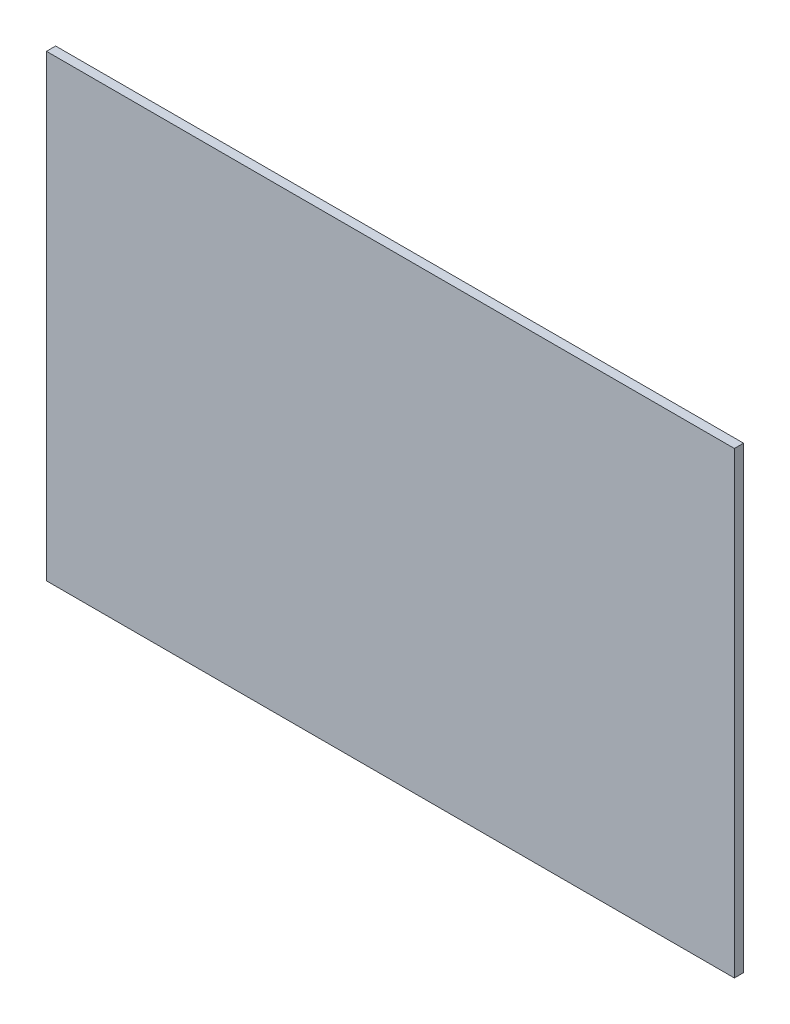
ISO-10303-21;
HEADER;
FILE_DESCRIPTION(('STEP AP214'),'2;1');
FILE_NAME('part.step','',(''),(''),'','','');
FILE_SCHEMA(('AUTOMOTIVE_DESIGN { 1 0 10303 214 1 1 1 1 }'));
ENDSEC;
DATA;
#1=APPLICATION_CONTEXT('core data for automotive mechanical design processes');
#2=APPLICATION_PROTOCOL_DEFINITION('international standard','automotive_design',2000,#1);
#3=PRODUCT_CONTEXT('',#1,'mechanical');
#4=PRODUCT('Part','Part','',(#3));
#5=PRODUCT_RELATED_PRODUCT_CATEGORY('part','',(#4));
#6=PRODUCT_DEFINITION_FORMATION('','',#4);
#7=PRODUCT_DEFINITION_CONTEXT('part definition',#1,'design');
#8=PRODUCT_DEFINITION('design','',#6,#7);
#9=PRODUCT_DEFINITION_SHAPE('','',#8);
#10=(LENGTH_UNIT() NAMED_UNIT(*) SI_UNIT(.MILLI.,.METRE.));
#11=(NAMED_UNIT(*) PLANE_ANGLE_UNIT() SI_UNIT($,.RADIAN.));
#12=(NAMED_UNIT(*) SI_UNIT($,.STERADIAN.) SOLID_ANGLE_UNIT());
#13=UNCERTAINTY_MEASURE_WITH_UNIT(LENGTH_MEASURE(1.E-05),#10,'distance_accuracy_value','');
#14=(GEOMETRIC_REPRESENTATION_CONTEXT(3) GLOBAL_UNCERTAINTY_ASSIGNED_CONTEXT((#13)) GLOBAL_UNIT_ASSIGNED_CONTEXT((#10,
#11,#12)) REPRESENTATION_CONTEXT('',''));
#15=CARTESIAN_POINT('',(0.,0.,0.));
#16=DIRECTION('',(0.,0.,1.));
#17=DIRECTION('',(1.,0.,0.));
#18=AXIS2_PLACEMENT_3D('',#15,#16,#17);
#19=CARTESIAN_POINT('',(300.,-217.891373801917,8.));
#20=DIRECTION('',(-1.,0.,0.));
#21=DIRECTION('',(0.,0.,1.));
#22=AXIS2_PLACEMENT_3D('',#19,#20,#21);
#23=PLANE('',#22);
#24=DIRECTION('',(0.,1.,0.));
#25=VECTOR('',#24,1.);
#26=CARTESIAN_POINT('',(300.,-217.891373801917,0.));
#27=LINE('',#26,#25);
#28=CARTESIAN_POINT('',(300.,-217.891373801917,0.));
#29=VERTEX_POINT('',#28);
#30=CARTESIAN_POINT('',(300.,182.108626198083,0.));
#31=VERTEX_POINT('',#30);
#32=EDGE_CURVE('E105',#29,#31,#27,.T.);
#33=ORIENTED_EDGE('',*,*,#32,.T.);
#34=DIRECTION('',(0.,0.,-1.));
#35=VECTOR('',#34,1.);
#36=CARTESIAN_POINT('',(300.,182.108626198083,8.));
#37=LINE('',#36,#35);
#38=CARTESIAN_POINT('',(300.,182.108626198083,8.));
#39=VERTEX_POINT('',#38);
#40=EDGE_CURVE('E11',#39,#31,#37,.T.);
#41=ORIENTED_EDGE('',*,*,#40,.F.);
#42=DIRECTION('',(0.,1.,0.));
#43=VECTOR('',#42,1.);
#44=CARTESIAN_POINT('',(300.,-217.891373801917,8.));
#45=LINE('',#44,#43);
#46=CARTESIAN_POINT('',(300.,-217.891373801917,8.));
#47=VERTEX_POINT('',#46);
#48=EDGE_CURVE('E89',#47,#39,#45,.T.);
#49=ORIENTED_EDGE('',*,*,#48,.F.);
#50=DIRECTION('',(0.,0.,-1.));
#51=VECTOR('',#50,1.);
#52=CARTESIAN_POINT('',(300.,-217.891373801917,8.));
#53=LINE('',#52,#51);
#54=EDGE_CURVE('E97',#47,#29,#53,.T.);
#55=ORIENTED_EDGE('',*,*,#54,.T.);
#56=EDGE_LOOP('',(#33,#41,#49,#55));
#57=FACE_BOUND('',#56,.T.);
#58=ADVANCED_FACE('F39',(#57),#23,.F.);
#59=CARTESIAN_POINT('',(-300.,182.108626198083,8.));
#60=DIRECTION('',(0.,-1.,0.));
#61=DIRECTION('',(0.,0.,-1.));
#62=AXIS2_PLACEMENT_3D('',#59,#60,#61);
#63=PLANE('',#62);
#64=DIRECTION('',(-1.,0.,0.));
#65=VECTOR('',#64,1.);
#66=CARTESIAN_POINT('',(-300.,182.108626198083,0.));
#67=LINE('',#66,#65);
#68=CARTESIAN_POINT('',(-300.,182.108626198083,0.));
#69=VERTEX_POINT('',#68);
#70=EDGE_CURVE('E92',#31,#69,#67,.T.);
#71=ORIENTED_EDGE('',*,*,#70,.T.);
#72=DIRECTION('',(0.,0.,-1.));
#73=VECTOR('',#72,1.);
#74=CARTESIAN_POINT('',(-300.,182.108626198083,8.));
#75=LINE('',#74,#73);
#76=CARTESIAN_POINT('',(-300.,182.108626198083,8.));
#77=VERTEX_POINT('',#76);
#78=EDGE_CURVE('E50',#77,#69,#75,.T.);
#79=ORIENTED_EDGE('',*,*,#78,.F.);
#80=DIRECTION('',(-1.,0.,0.));
#81=VECTOR('',#80,1.);
#82=CARTESIAN_POINT('',(-300.,182.108626198083,8.));
#83=LINE('',#82,#81);
#84=EDGE_CURVE('E82',#39,#77,#83,.T.);
#85=ORIENTED_EDGE('',*,*,#84,.F.);
#86=ORIENTED_EDGE('',*,*,#40,.T.);
#87=EDGE_LOOP('',(#71,#79,#85,#86));
#88=FACE_BOUND('',#87,.T.);
#89=ADVANCED_FACE('F93',(#88),#63,.F.);
#90=CARTESIAN_POINT('',(-300.,-217.891373801917,8.));
#91=DIRECTION('',(1.,0.,0.));
#92=DIRECTION('',(0.,0.,-1.));
#93=AXIS2_PLACEMENT_3D('',#90,#91,#92);
#94=PLANE('',#93);
#95=DIRECTION('',(0.,-1.,0.));
#96=VECTOR('',#95,1.);
#97=CARTESIAN_POINT('',(-300.,-217.891373801917,0.));
#98=LINE('',#97,#96);
#99=CARTESIAN_POINT('',(-300.,-217.891373801917,0.));
#100=VERTEX_POINT('',#99);
#101=EDGE_CURVE('E72',#69,#100,#98,.T.);
#102=ORIENTED_EDGE('',*,*,#101,.T.);
#103=DIRECTION('',(0.,0.,-1.));
#104=VECTOR('',#103,1.);
#105=CARTESIAN_POINT('',(-300.,-217.891373801917,8.));
#106=LINE('',#105,#104);
#107=CARTESIAN_POINT('',(-300.,-217.891373801917,8.));
#108=VERTEX_POINT('',#107);
#109=EDGE_CURVE('E94',#108,#100,#106,.T.);
#110=ORIENTED_EDGE('',*,*,#109,.F.);
#111=DIRECTION('',(0.,-1.,0.));
#112=VECTOR('',#111,1.);
#113=CARTESIAN_POINT('',(-300.,-217.891373801917,8.));
#114=LINE('',#113,#112);
#115=EDGE_CURVE('E88',#77,#108,#114,.T.);
#116=ORIENTED_EDGE('',*,*,#115,.F.);
#117=ORIENTED_EDGE('',*,*,#78,.T.);
#118=EDGE_LOOP('',(#102,#110,#116,#117));
#119=FACE_BOUND('',#118,.T.);
#120=ADVANCED_FACE('F96',(#119),#94,.F.);
#121=CARTESIAN_POINT('',(-300.,-217.891373801917,8.));
#122=DIRECTION('',(0.,1.,0.));
#123=DIRECTION('',(0.,0.,1.));
#124=AXIS2_PLACEMENT_3D('',#121,#122,#123);
#125=PLANE('',#124);
#126=DIRECTION('',(1.,0.,0.));
#127=VECTOR('',#126,1.);
#128=CARTESIAN_POINT('',(-300.,-217.891373801917,0.));
#129=LINE('',#128,#127);
#130=EDGE_CURVE('E76',#100,#29,#129,.T.);
#131=ORIENTED_EDGE('',*,*,#130,.T.);
#132=ORIENTED_EDGE('',*,*,#54,.F.);
#133=DIRECTION('',(1.,0.,0.));
#134=VECTOR('',#133,1.);
#135=CARTESIAN_POINT('',(-300.,-217.891373801917,8.));
#136=LINE('',#135,#134);
#137=EDGE_CURVE('E54',#108,#47,#136,.T.);
#138=ORIENTED_EDGE('',*,*,#137,.F.);
#139=ORIENTED_EDGE('',*,*,#109,.T.);
#140=EDGE_LOOP('',(#131,#132,#138,#139));
#141=FACE_BOUND('',#140,.T.);
#142=ADVANCED_FACE('F108',(#141),#125,.F.);
#143=CARTESIAN_POINT('',(0.,0.,8.));
#144=DIRECTION('',(0.,0.,-1.));
#145=DIRECTION('',(-1.,0.,0.));
#146=AXIS2_PLACEMENT_3D('',#143,#144,#145);
#147=PLANE('',#146);
#148=ORIENTED_EDGE('',*,*,#48,.T.);
#149=ORIENTED_EDGE('',*,*,#84,.T.);
#150=ORIENTED_EDGE('',*,*,#115,.T.);
#151=ORIENTED_EDGE('',*,*,#137,.T.);
#152=EDGE_LOOP('',(#148,#149,#150,#151));
#153=FACE_BOUND('',#152,.T.);
#154=ADVANCED_FACE('F86',(#153),#147,.F.);
#155=CARTESIAN_POINT('',(0.,0.,0.));
#156=DIRECTION('',(0.,0.,-1.));
#157=DIRECTION('',(-1.,0.,0.));
#158=AXIS2_PLACEMENT_3D('',#155,#156,#157);
#159=PLANE('',#158);
#160=ORIENTED_EDGE('',*,*,#32,.F.);
#161=ORIENTED_EDGE('',*,*,#130,.F.);
#162=ORIENTED_EDGE('',*,*,#101,.F.);
#163=ORIENTED_EDGE('',*,*,#70,.F.);
#164=EDGE_LOOP('',(#160,#161,#162,#163));
#165=FACE_BOUND('',#164,.T.);
#166=ADVANCED_FACE('F115',(#165),#159,.T.);
#167=CLOSED_SHELL('',(#58,#89,#120,#142,#154,#166));
#168=MANIFOLD_SOLID_BREP('B2',#167);
#169=ADVANCED_BREP_SHAPE_REPRESENTATION('',(#18,#168),#14);
#170=SHAPE_DEFINITION_REPRESENTATION(#9,#169);
ENDSEC;
END-ISO-10303-21;
